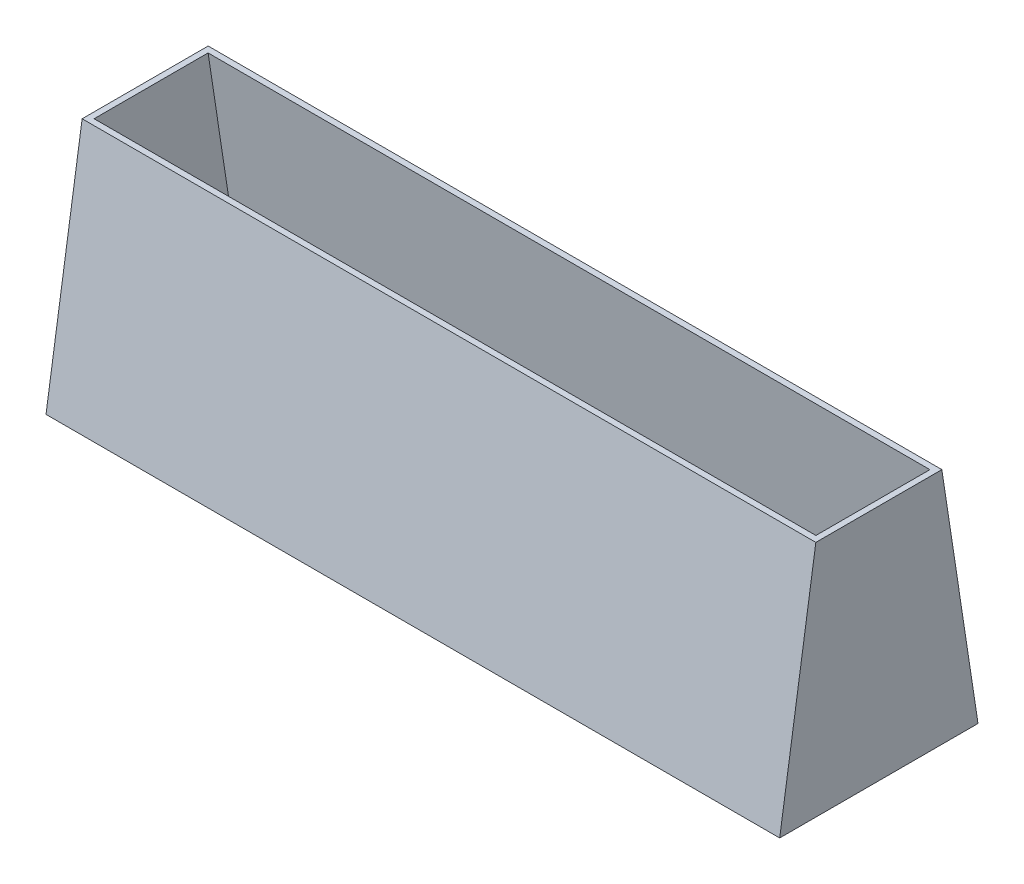
ISO-10303-21;
HEADER;
FILE_DESCRIPTION(('STEP AP214'),'2;1');
FILE_NAME('part.step','',(''),(''),'','','');
FILE_SCHEMA(('AUTOMOTIVE_DESIGN { 1 0 10303 214 1 1 1 1 }'));
ENDSEC;
DATA;
#1=APPLICATION_CONTEXT('core data for automotive mechanical design processes');
#2=APPLICATION_PROTOCOL_DEFINITION('international standard','automotive_design',2000,#1);
#3=PRODUCT_CONTEXT('',#1,'mechanical');
#4=PRODUCT('Part','Part','',(#3));
#5=PRODUCT_RELATED_PRODUCT_CATEGORY('part','',(#4));
#6=PRODUCT_DEFINITION_FORMATION('','',#4);
#7=PRODUCT_DEFINITION_CONTEXT('part definition',#1,'design');
#8=PRODUCT_DEFINITION('design','',#6,#7);
#9=PRODUCT_DEFINITION_SHAPE('','',#8);
#10=(LENGTH_UNIT() NAMED_UNIT(*) SI_UNIT(.MILLI.,.METRE.));
#11=(NAMED_UNIT(*) PLANE_ANGLE_UNIT() SI_UNIT($,.RADIAN.));
#12=(NAMED_UNIT(*) SI_UNIT($,.STERADIAN.) SOLID_ANGLE_UNIT());
#13=UNCERTAINTY_MEASURE_WITH_UNIT(LENGTH_MEASURE(1.E-05),#10,'distance_accuracy_value','');
#14=(GEOMETRIC_REPRESENTATION_CONTEXT(3) GLOBAL_UNCERTAINTY_ASSIGNED_CONTEXT((#13)) GLOBAL_UNIT_ASSIGNED_CONTEXT((#10,
#11,#12)) REPRESENTATION_CONTEXT('',''));
#15=CARTESIAN_POINT('',(0.,0.,0.));
#16=DIRECTION('',(0.,0.,1.));
#17=DIRECTION('',(1.,0.,0.));
#18=AXIS2_PLACEMENT_3D('',#15,#16,#17);
#19=CARTESIAN_POINT('',(370.,119.549607644801,-21.1882206588915));
#20=DIRECTION('',(0.,-0.150130785066359,-0.988666145559439));
#21=DIRECTION('',(0.,0.98866614555944,-0.150130785066359));
#22=AXIS2_PLACEMENT_3D('',#19,#20,#21);
#23=PLANE('',#22);
#24=DIRECTION('',(0.,-0.98866614555944,0.150130785066359));
#25=VECTOR('',#24,1.);
#26=CARTESIAN_POINT('',(3.,-0.450392355199076,-2.96599843667832));
#27=LINE('',#26,#25);
#28=CARTESIAN_POINT('',(3.,120.,-21.2566135720883));
#29=VERTEX_POINT('',#28);
#30=CARTESIAN_POINT('',(3.,3.,-3.48994690543051));
#31=VERTEX_POINT('',#30);
#32=EDGE_CURVE('E162',#29,#31,#27,.T.);
#33=ORIENTED_EDGE('',*,*,#32,.F.);
#34=DIRECTION('',(-1.,0.,0.));
#35=VECTOR('',#34,1.);
#36=CARTESIAN_POINT('',(370.,120.,-21.2566135720883));
#37=LINE('',#36,#35);
#38=CARTESIAN_POINT('',(367.,120.,-21.2566135720883));
#39=VERTEX_POINT('',#38);
#40=EDGE_CURVE('E187',#39,#29,#37,.T.);
#41=ORIENTED_EDGE('',*,*,#40,.F.);
#42=DIRECTION('',(0.,-0.98866614555944,0.150130785066359));
#43=VECTOR('',#42,1.);
#44=CARTESIAN_POINT('',(367.,-0.450392355199076,-2.96599843667832));
#45=LINE('',#44,#43);
#46=CARTESIAN_POINT('',(367.,3.,-3.48994690543051));
#47=VERTEX_POINT('',#46);
#48=EDGE_CURVE('E171',#39,#47,#45,.T.);
#49=ORIENTED_EDGE('',*,*,#48,.T.);
#50=DIRECTION('',(-1.,0.,0.));
#51=VECTOR('',#50,1.);
#52=CARTESIAN_POINT('',(370.,3.,-3.48994690543053));
#53=LINE('',#52,#51);
#54=EDGE_CURVE('E166',#47,#31,#53,.T.);
#55=ORIENTED_EDGE('',*,*,#54,.T.);
#56=EDGE_LOOP('',(#33,#41,#49,#55));
#57=FACE_BOUND('',#56,.T.);
#58=DIRECTION('',(0.,-0.98866614555944,0.150130785066359));
#59=VECTOR('',#58,1.);
#60=CARTESIAN_POINT('',(330.,29.2662865818531,-7.47853116415437));
#61=LINE('',#60,#59);
#62=CARTESIAN_POINT('',(330.,33.060839747405,-8.05474108929343));
#63=VERTEX_POINT('',#62);
#64=CARTESIAN_POINT('',(330.,29.9548268940104,-7.58308728563006));
#65=VERTEX_POINT('',#64);
#66=EDGE_CURVE('E157',#63,#65,#61,.T.);
#67=ORIENTED_EDGE('',*,*,#66,.F.);
#68=DIRECTION('',(1.,0.,0.));
#69=VECTOR('',#68,1.);
#70=CARTESIAN_POINT('',(280.,33.060839747405,-8.05474108929343));
#71=LINE('',#70,#69);
#72=CARTESIAN_POINT('',(280.,33.060839747405,-8.05474108929343));
#73=VERTEX_POINT('',#72);
#74=EDGE_CURVE('E153',#73,#63,#71,.T.);
#75=ORIENTED_EDGE('',*,*,#74,.F.);
#76=DIRECTION('',(0.,0.98866614555944,-0.150130785066359));
#77=VECTOR('',#76,1.);
#78=CARTESIAN_POINT('',(280.,29.2662865818531,-7.47853116415437));
#79=LINE('',#78,#77);
#80=CARTESIAN_POINT('',(280.,29.9548268940104,-7.58308728563006));
#81=VERTEX_POINT('',#80);
#82=EDGE_CURVE('E130',#81,#73,#79,.T.);
#83=ORIENTED_EDGE('',*,*,#82,.F.);
#84=DIRECTION('',(-1.,0.,0.));
#85=VECTOR('',#84,1.);
#86=CARTESIAN_POINT('',(280.,29.9548268940104,-7.58308728563006));
#87=LINE('',#86,#85);
#88=EDGE_CURVE('E159',#65,#81,#87,.T.);
#89=ORIENTED_EDGE('',*,*,#88,.F.);
#90=EDGE_LOOP('',(#67,#75,#83,#89));
#91=FACE_BOUND('',#90,.T.);
#92=ADVANCED_FACE('F38',(#57,#91),#23,.T.);
#93=CARTESIAN_POINT('',(370.,119.549607644801,-78.8117793410917));
#94=DIRECTION('',(0.,-0.150130785066495,0.988666145559419));
#95=DIRECTION('',(0.,-0.988666145559419,-0.150130785066495));
#96=AXIS2_PLACEMENT_3D('',#93,#94,#95);
#97=PLANE('',#96);
#98=DIRECTION('',(0.,0.988666145559419,0.150130785066495));
#99=VECTOR('',#98,1.);
#100=CARTESIAN_POINT('',(3.,14.3925301049506,-94.7800763008535));
#101=LINE('',#100,#99);
#102=CARTESIAN_POINT('',(3.,3.,-96.510053094569));
#103=VERTEX_POINT('',#102);
#104=CARTESIAN_POINT('',(3.,120.,-78.7433864278947));
#105=VERTEX_POINT('',#104);
#106=EDGE_CURVE('E177',#103,#105,#101,.T.);
#107=ORIENTED_EDGE('',*,*,#106,.F.);
#108=DIRECTION('',(-1.,0.,0.));
#109=VECTOR('',#108,1.);
#110=CARTESIAN_POINT('',(370.,3.,-96.510053094569));
#111=LINE('',#110,#109);
#112=CARTESIAN_POINT('',(367.,3.,-96.510053094569));
#113=VERTEX_POINT('',#112);
#114=EDGE_CURVE('E170',#113,#103,#111,.T.);
#115=ORIENTED_EDGE('',*,*,#114,.F.);
#116=DIRECTION('',(0.,0.988666145559419,0.150130785066495));
#117=VECTOR('',#116,1.);
#118=CARTESIAN_POINT('',(367.,14.3925301049506,-94.7800763008535));
#119=LINE('',#118,#117);
#120=CARTESIAN_POINT('',(367.,120.,-78.7433864278947));
#121=VERTEX_POINT('',#120);
#122=EDGE_CURVE('E182',#113,#121,#119,.T.);
#123=ORIENTED_EDGE('',*,*,#122,.T.);
#124=DIRECTION('',(-1.,0.,0.));
#125=VECTOR('',#124,1.);
#126=CARTESIAN_POINT('',(370.,120.,-78.7433864278947));
#127=LINE('',#126,#125);
#128=EDGE_CURVE('E180',#121,#105,#127,.T.);
#129=ORIENTED_EDGE('',*,*,#128,.T.);
#130=EDGE_LOOP('',(#107,#115,#123,#129));
#131=FACE_BOUND('',#130,.T.);
#132=DIRECTION('',(0.,-0.988666145559419,-0.150130785066492));
#133=VECTOR('',#132,1.);
#134=CARTESIAN_POINT('',(280.,45.512644259055,-90.0544293367098));
#135=LINE('',#134,#133);
#136=CARTESIAN_POINT('',(280.,45.512644259055,-90.0544293367098));
#137=VERTEX_POINT('',#136);
#138=CARTESIAN_POINT('',(280.,42.5466458223767,-90.5048216919092));
#139=VERTEX_POINT('',#138);
#140=EDGE_CURVE('E61',#137,#139,#135,.T.);
#141=ORIENTED_EDGE('',*,*,#140,.F.);
#142=DIRECTION('',(-1.,0.,0.));
#143=VECTOR('',#142,1.);
#144=CARTESIAN_POINT('',(280.,45.512644259055,-90.0544293367098));
#145=LINE('',#144,#143);
#146=CARTESIAN_POINT('',(330.,45.512644259055,-90.0544293367098));
#147=VERTEX_POINT('',#146);
#148=EDGE_CURVE('E134',#147,#137,#145,.T.);
#149=ORIENTED_EDGE('',*,*,#148,.F.);
#150=DIRECTION('',(0.,0.988666145559419,0.150130785066491));
#151=VECTOR('',#150,1.);
#152=CARTESIAN_POINT('',(330.,45.512644259055,-90.0544293367098));
#153=LINE('',#152,#151);
#154=CARTESIAN_POINT('',(330.,42.5466458223768,-90.5048216919093));
#155=VERTEX_POINT('',#154);
#156=EDGE_CURVE('E142',#155,#147,#153,.T.);
#157=ORIENTED_EDGE('',*,*,#156,.F.);
#158=DIRECTION('',(1.,0.,0.));
#159=VECTOR('',#158,1.);
#160=CARTESIAN_POINT('',(280.,42.5466458223768,-90.5048216919093));
#161=LINE('',#160,#159);
#162=EDGE_CURVE('E146',#139,#155,#161,.T.);
#163=ORIENTED_EDGE('',*,*,#162,.F.);
#164=EDGE_LOOP('',(#141,#149,#157,#163));
#165=FACE_BOUND('',#164,.T.);
#166=ADVANCED_FACE('F145',(#131,#165),#97,.T.);
#167=CARTESIAN_POINT('',(370.,120.,-18.2222222222132));
#168=DIRECTION('',(0.,-1.,0.));
#169=DIRECTION('',(0.,0.,-1.));
#170=AXIS2_PLACEMENT_3D('',#167,#168,#169);
#171=PLANE('',#170);
#172=DIRECTION('',(0.,0.,1.));
#173=VECTOR('',#172,1.);
#174=CARTESIAN_POINT('',(0.,120.,-18.2222222222132));
#175=LINE('',#174,#173);
#176=CARTESIAN_POINT('',(0.,120.,-81.77777777777));
#177=VERTEX_POINT('',#176);
#178=CARTESIAN_POINT('',(0.,120.,-18.2222222222132));
#179=VERTEX_POINT('',#178);
#180=EDGE_CURVE('E199',#177,#179,#175,.T.);
#181=ORIENTED_EDGE('',*,*,#180,.T.);
#182=DIRECTION('',(-1.,0.,0.));
#183=VECTOR('',#182,1.);
#184=CARTESIAN_POINT('',(370.,120.,-18.2222222222132));
#185=LINE('',#184,#183);
#186=CARTESIAN_POINT('',(370.,120.,-18.2222222222132));
#187=VERTEX_POINT('',#186);
#188=EDGE_CURVE('E205',#187,#179,#185,.T.);
#189=ORIENTED_EDGE('',*,*,#188,.F.);
#190=DIRECTION('',(0.,0.,1.));
#191=VECTOR('',#190,1.);
#192=CARTESIAN_POINT('',(370.,120.,-18.2222222222132));
#193=LINE('',#192,#191);
#194=CARTESIAN_POINT('',(370.,120.,-81.77777777777));
#195=VERTEX_POINT('',#194);
#196=EDGE_CURVE('E203',#195,#187,#193,.T.);
#197=ORIENTED_EDGE('',*,*,#196,.F.);
#198=DIRECTION('',(-1.,0.,0.));
#199=VECTOR('',#198,1.);
#200=CARTESIAN_POINT('',(370.,120.,-81.77777777777));
#201=LINE('',#200,#199);
#202=EDGE_CURVE('E215',#195,#177,#201,.T.);
#203=ORIENTED_EDGE('',*,*,#202,.T.);
#204=EDGE_LOOP('',(#181,#189,#197,#203));
#205=FACE_BOUND('',#204,.T.);
#206=DIRECTION('',(0.,0.,1.));
#207=VECTOR('',#206,1.);
#208=CARTESIAN_POINT('',(3.,120.,0.));
#209=LINE('',#208,#207);
#210=EDGE_CURVE('E175',#105,#29,#209,.T.);
#211=ORIENTED_EDGE('',*,*,#210,.F.);
#212=ORIENTED_EDGE('',*,*,#128,.F.);
#213=DIRECTION('',(0.,0.,1.));
#214=VECTOR('',#213,1.);
#215=CARTESIAN_POINT('',(367.,120.,0.));
#216=LINE('',#215,#214);
#217=EDGE_CURVE('E186',#121,#39,#216,.T.);
#218=ORIENTED_EDGE('',*,*,#217,.T.);
#219=ORIENTED_EDGE('',*,*,#40,.T.);
#220=EDGE_LOOP('',(#211,#212,#218,#219));
#221=FACE_BOUND('',#220,.T.);
#222=ADVANCED_FACE('F231',(#205,#221),#171,.F.);
#223=CARTESIAN_POINT('',(370.,120.,-18.2222222222132));
#224=DIRECTION('',(0.,-0.150130785066359,-0.988666145559439));
#225=DIRECTION('',(0.,0.98866614555944,-0.150130785066359));
#226=AXIS2_PLACEMENT_3D('',#223,#224,#225);
#227=PLANE('',#226);
#228=DIRECTION('',(0.,-0.988666145559439,0.150130785066359));
#229=VECTOR('',#228,1.);
#230=CARTESIAN_POINT('',(0.,120.,-18.2222222222132));
#231=LINE('',#230,#229);
#232=CARTESIAN_POINT('',(0.,0.,0.));
#233=VERTEX_POINT('',#232);
#234=EDGE_CURVE('E169',#179,#233,#231,.T.);
#235=ORIENTED_EDGE('',*,*,#234,.T.);
#236=DIRECTION('',(-1.,0.,0.));
#237=VECTOR('',#236,1.);
#238=CARTESIAN_POINT('',(370.,0.,0.));
#239=LINE('',#238,#237);
#240=CARTESIAN_POINT('',(370.,0.,0.));
#241=VERTEX_POINT('',#240);
#242=EDGE_CURVE('E11',#241,#233,#239,.T.);
#243=ORIENTED_EDGE('',*,*,#242,.F.);
#244=DIRECTION('',(0.,-0.988666145559439,0.150130785066359));
#245=VECTOR('',#244,1.);
#246=CARTESIAN_POINT('',(370.,120.,-18.2222222222132));
#247=LINE('',#246,#245);
#248=EDGE_CURVE('E195',#187,#241,#247,.T.);
#249=ORIENTED_EDGE('',*,*,#248,.F.);
#250=ORIENTED_EDGE('',*,*,#188,.T.);
#251=EDGE_LOOP('',(#235,#243,#249,#250));
#252=FACE_BOUND('',#251,.T.);
#253=ADVANCED_FACE('F40',(#252),#227,.F.);
#254=CARTESIAN_POINT('',(370.,0.,-100.));
#255=DIRECTION('',(0.,1.,0.));
#256=DIRECTION('',(0.,0.,1.));
#257=AXIS2_PLACEMENT_3D('',#254,#255,#256);
#258=PLANE('',#257);
#259=DIRECTION('',(0.,0.,-1.));
#260=VECTOR('',#259,1.);
#261=CARTESIAN_POINT('',(0.,0.,-100.));
#262=LINE('',#261,#260);
#263=CARTESIAN_POINT('',(0.,0.,-100.));
#264=VERTEX_POINT('',#263);
#265=EDGE_CURVE('E208',#233,#264,#262,.T.);
#266=ORIENTED_EDGE('',*,*,#265,.T.);
#267=DIRECTION('',(-1.,0.,0.));
#268=VECTOR('',#267,1.);
#269=CARTESIAN_POINT('',(370.,0.,-100.));
#270=LINE('',#269,#268);
#271=CARTESIAN_POINT('',(370.,0.,-100.));
#272=VERTEX_POINT('',#271);
#273=EDGE_CURVE('E46',#272,#264,#270,.T.);
#274=ORIENTED_EDGE('',*,*,#273,.F.);
#275=DIRECTION('',(0.,0.,-1.));
#276=VECTOR('',#275,1.);
#277=CARTESIAN_POINT('',(370.,0.,-100.));
#278=LINE('',#277,#276);
#279=EDGE_CURVE('E198',#241,#272,#278,.T.);
#280=ORIENTED_EDGE('',*,*,#279,.F.);
#281=ORIENTED_EDGE('',*,*,#242,.T.);
#282=EDGE_LOOP('',(#266,#274,#280,#281));
#283=FACE_BOUND('',#282,.T.);
#284=ADVANCED_FACE('F239',(#283),#258,.F.);
#285=CARTESIAN_POINT('',(370.,120.,-81.77777777777));
#286=DIRECTION('',(0.,-0.150130785066495,0.988666145559419));
#287=DIRECTION('',(0.,-0.988666145559419,-0.150130785066495));
#288=AXIS2_PLACEMENT_3D('',#285,#286,#287);
#289=PLANE('',#288);
#290=DIRECTION('',(0.,0.988666145559419,0.150130785066495));
#291=VECTOR('',#290,1.);
#292=CARTESIAN_POINT('',(0.,120.,-81.77777777777));
#293=LINE('',#292,#291);
#294=EDGE_CURVE('E210',#264,#177,#293,.T.);
#295=ORIENTED_EDGE('',*,*,#294,.T.);
#296=ORIENTED_EDGE('',*,*,#202,.F.);
#297=DIRECTION('',(0.,0.988666145559419,0.150130785066495));
#298=VECTOR('',#297,1.);
#299=CARTESIAN_POINT('',(370.,120.,-81.77777777777));
#300=LINE('',#299,#298);
#301=EDGE_CURVE('E201',#272,#195,#300,.T.);
#302=ORIENTED_EDGE('',*,*,#301,.F.);
#303=ORIENTED_EDGE('',*,*,#273,.T.);
#304=EDGE_LOOP('',(#295,#296,#302,#303));
#305=FACE_BOUND('',#304,.T.);
#306=ADVANCED_FACE('F222',(#305),#289,.F.);
#307=CARTESIAN_POINT('',(370.,0.,0.));
#308=DIRECTION('',(-1.,0.,0.));
#309=DIRECTION('',(0.,0.,1.));
#310=AXIS2_PLACEMENT_3D('',#307,#308,#309);
#311=PLANE('',#310);
#312=ORIENTED_EDGE('',*,*,#248,.T.);
#313=ORIENTED_EDGE('',*,*,#279,.T.);
#314=ORIENTED_EDGE('',*,*,#301,.T.);
#315=ORIENTED_EDGE('',*,*,#196,.T.);
#316=EDGE_LOOP('',(#312,#313,#314,#315));
#317=FACE_BOUND('',#316,.T.);
#318=ADVANCED_FACE('F238',(#317),#311,.F.);
#319=CARTESIAN_POINT('',(0.,0.,0.));
#320=DIRECTION('',(-1.,0.,0.));
#321=DIRECTION('',(0.,0.,1.));
#322=AXIS2_PLACEMENT_3D('',#319,#320,#321);
#323=PLANE('',#322);
#324=ORIENTED_EDGE('',*,*,#234,.F.);
#325=ORIENTED_EDGE('',*,*,#180,.F.);
#326=ORIENTED_EDGE('',*,*,#294,.F.);
#327=ORIENTED_EDGE('',*,*,#265,.F.);
#328=EDGE_LOOP('',(#324,#325,#326,#327));
#329=FACE_BOUND('',#328,.T.);
#330=ADVANCED_FACE('F228',(#329),#323,.T.);
#331=CARTESIAN_POINT('',(370.,3.,-100.));
#332=DIRECTION('',(0.,1.,0.));
#333=DIRECTION('',(0.,0.,1.));
#334=AXIS2_PLACEMENT_3D('',#331,#332,#333);
#335=PLANE('',#334);
#336=DIRECTION('',(0.,0.,-1.));
#337=VECTOR('',#336,1.);
#338=CARTESIAN_POINT('',(3.,3.,0.));
#339=LINE('',#338,#337);
#340=EDGE_CURVE('E165',#31,#103,#339,.T.);
#341=ORIENTED_EDGE('',*,*,#340,.F.);
#342=ORIENTED_EDGE('',*,*,#54,.F.);
#343=DIRECTION('',(0.,0.,-1.));
#344=VECTOR('',#343,1.);
#345=CARTESIAN_POINT('',(367.,3.,0.));
#346=LINE('',#345,#344);
#347=EDGE_CURVE('E174',#47,#113,#346,.T.);
#348=ORIENTED_EDGE('',*,*,#347,.T.);
#349=ORIENTED_EDGE('',*,*,#114,.T.);
#350=EDGE_LOOP('',(#341,#342,#348,#349));
#351=FACE_BOUND('',#350,.T.);
#352=ADVANCED_FACE('F259',(#351),#335,.T.);
#353=CARTESIAN_POINT('',(367.,0.,0.));
#354=DIRECTION('',(-1.,0.,0.));
#355=DIRECTION('',(0.,0.,1.));
#356=AXIS2_PLACEMENT_3D('',#353,#354,#355);
#357=PLANE('',#356);
#358=ORIENTED_EDGE('',*,*,#48,.F.);
#359=ORIENTED_EDGE('',*,*,#217,.F.);
#360=ORIENTED_EDGE('',*,*,#122,.F.);
#361=ORIENTED_EDGE('',*,*,#347,.F.);
#362=EDGE_LOOP('',(#358,#359,#360,#361));
#363=FACE_BOUND('',#362,.T.);
#364=ADVANCED_FACE('F261',(#363),#357,.T.);
#365=CARTESIAN_POINT('',(3.,0.,0.));
#366=DIRECTION('',(-1.,0.,0.));
#367=DIRECTION('',(0.,0.,1.));
#368=AXIS2_PLACEMENT_3D('',#365,#366,#367);
#369=PLANE('',#368);
#370=ORIENTED_EDGE('',*,*,#32,.T.);
#371=ORIENTED_EDGE('',*,*,#340,.T.);
#372=ORIENTED_EDGE('',*,*,#106,.T.);
#373=ORIENTED_EDGE('',*,*,#210,.T.);
#374=EDGE_LOOP('',(#370,#371,#372,#373));
#375=FACE_BOUND('',#374,.T.);
#376=ADVANCED_FACE('F266',(#375),#369,.F.);
#377=CARTESIAN_POINT('',(280.,31.1198138925343,4.72762429643493));
#378=DIRECTION('',(0.,-0.988666145559419,-0.150130785066495));
#379=DIRECTION('',(0.,0.150130785066495,-0.988666145559419));
#380=AXIS2_PLACEMENT_3D('',#377,#378,#379);
#381=PLANE('',#380);
#382=DIRECTION('',(0.,0.150130785066495,-0.988666145559419));
#383=VECTOR('',#382,1.);
#384=CARTESIAN_POINT('',(280.,31.1198138925343,4.72762429643493));
#385=LINE('',#384,#383);
#386=EDGE_CURVE('E126',#73,#137,#385,.T.);
#387=ORIENTED_EDGE('',*,*,#386,.F.);
#388=ORIENTED_EDGE('',*,*,#74,.T.);
#389=DIRECTION('',(0.,0.150130785066495,-0.988666145559419));
#390=VECTOR('',#389,1.);
#391=CARTESIAN_POINT('',(330.,31.1198138925343,4.72762429643493));
#392=LINE('',#391,#390);
#393=EDGE_CURVE('E133',#63,#147,#392,.T.);
#394=ORIENTED_EDGE('',*,*,#393,.T.);
#395=ORIENTED_EDGE('',*,*,#148,.T.);
#396=EDGE_LOOP('',(#387,#388,#394,#395));
#397=FACE_BOUND('',#396,.T.);
#398=ADVANCED_FACE('F137',(#397),#381,.F.);
#399=CARTESIAN_POINT('',(280.,31.1198138925343,4.72762429643493));
#400=DIRECTION('',(1.,0.,0.));
#401=DIRECTION('',(0.,0.,-1.));
#402=AXIS2_PLACEMENT_3D('',#399,#400,#401);
#403=PLANE('',#402);
#404=DIRECTION('',(0.,0.150130785066495,-0.988666145559419));
#405=VECTOR('',#404,1.);
#406=CARTESIAN_POINT('',(280.,28.153815455856,4.27723194123546));
#407=LINE('',#406,#405);
#408=EDGE_CURVE('E151',#81,#139,#407,.T.);
#409=ORIENTED_EDGE('',*,*,#408,.F.);
#410=ORIENTED_EDGE('',*,*,#82,.T.);
#411=ORIENTED_EDGE('',*,*,#386,.T.);
#412=ORIENTED_EDGE('',*,*,#140,.T.);
#413=EDGE_LOOP('',(#409,#410,#411,#412));
#414=FACE_BOUND('',#413,.T.);
#415=ADVANCED_FACE('F128',(#414),#403,.F.);
#416=CARTESIAN_POINT('',(330.,31.1198138925343,4.72762429643493));
#417=DIRECTION('',(-1.,0.,0.));
#418=DIRECTION('',(0.,0.,1.));
#419=AXIS2_PLACEMENT_3D('',#416,#417,#418);
#420=PLANE('',#419);
#421=ORIENTED_EDGE('',*,*,#393,.F.);
#422=ORIENTED_EDGE('',*,*,#66,.T.);
#423=DIRECTION('',(0.,0.150130785066495,-0.988666145559419));
#424=VECTOR('',#423,1.);
#425=CARTESIAN_POINT('',(330.,28.153815455856,4.27723194123546));
#426=LINE('',#425,#424);
#427=EDGE_CURVE('E53',#65,#155,#426,.T.);
#428=ORIENTED_EDGE('',*,*,#427,.T.);
#429=ORIENTED_EDGE('',*,*,#156,.T.);
#430=EDGE_LOOP('',(#421,#422,#428,#429));
#431=FACE_BOUND('',#430,.T.);
#432=ADVANCED_FACE('F333',(#431),#420,.F.);
#433=CARTESIAN_POINT('',(280.,28.153815455856,4.27723194123546));
#434=DIRECTION('',(0.,0.988666145559419,0.150130785066495));
#435=DIRECTION('',(0.,-0.150130785066495,0.988666145559419));
#436=AXIS2_PLACEMENT_3D('',#433,#434,#435);
#437=PLANE('',#436);
#438=ORIENTED_EDGE('',*,*,#427,.F.);
#439=ORIENTED_EDGE('',*,*,#88,.T.);
#440=ORIENTED_EDGE('',*,*,#408,.T.);
#441=ORIENTED_EDGE('',*,*,#162,.T.);
#442=EDGE_LOOP('',(#438,#439,#440,#441));
#443=FACE_BOUND('',#442,.T.);
#444=ADVANCED_FACE('F271',(#443),#437,.F.);
#445=CLOSED_SHELL('',(#92,#166,#222,#253,#284,#306,#318,#330,#352,#364,#376,#398,#415,#432,#444));
#446=MANIFOLD_SOLID_BREP('B2',#445);
#447=ADVANCED_BREP_SHAPE_REPRESENTATION('',(#18,#446),#14);
#448=SHAPE_DEFINITION_REPRESENTATION(#9,#447);
ENDSEC;
END-ISO-10303-21;
